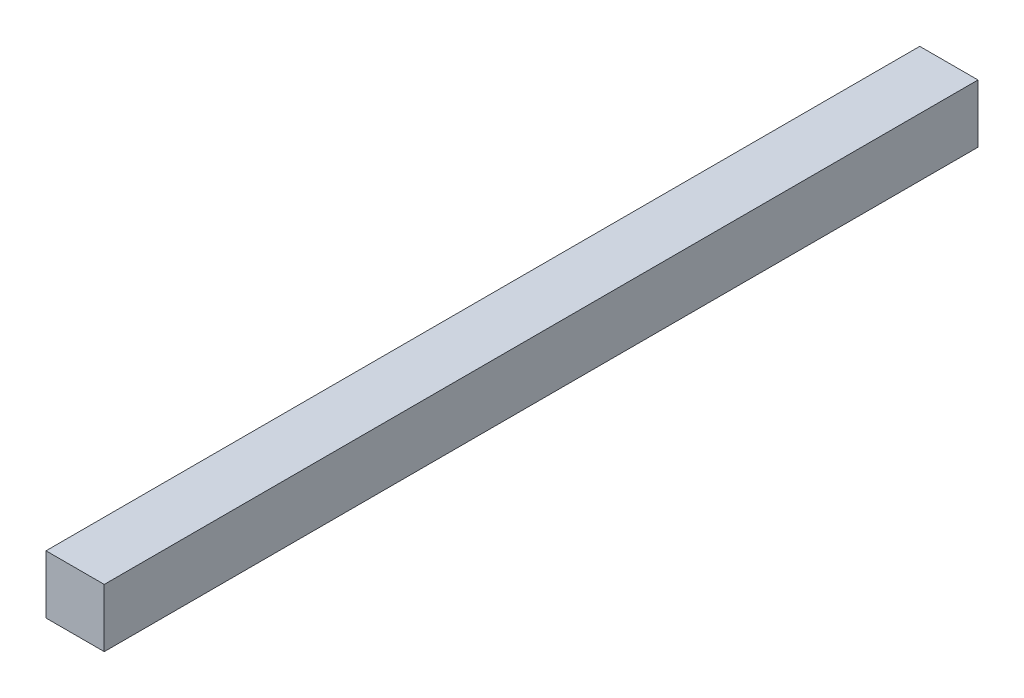
ISO-10303-21;
HEADER;
FILE_DESCRIPTION(('STEP AP214'),'2;1');
FILE_NAME('part.step','',(''),(''),'','','');
FILE_SCHEMA(('AUTOMOTIVE_DESIGN { 1 0 10303 214 1 1 1 1 }'));
ENDSEC;
DATA;
#1=APPLICATION_CONTEXT('core data for automotive mechanical design processes');
#2=APPLICATION_PROTOCOL_DEFINITION('international standard','automotive_design',2000,#1);
#3=PRODUCT_CONTEXT('',#1,'mechanical');
#4=PRODUCT('Part','Part','',(#3));
#5=PRODUCT_RELATED_PRODUCT_CATEGORY('part','',(#4));
#6=PRODUCT_DEFINITION_FORMATION('','',#4);
#7=PRODUCT_DEFINITION_CONTEXT('part definition',#1,'design');
#8=PRODUCT_DEFINITION('design','',#6,#7);
#9=PRODUCT_DEFINITION_SHAPE('','',#8);
#10=(LENGTH_UNIT() NAMED_UNIT(*) SI_UNIT(.MILLI.,.METRE.));
#11=(NAMED_UNIT(*) PLANE_ANGLE_UNIT() SI_UNIT($,.RADIAN.));
#12=(NAMED_UNIT(*) SI_UNIT($,.STERADIAN.) SOLID_ANGLE_UNIT());
#13=UNCERTAINTY_MEASURE_WITH_UNIT(LENGTH_MEASURE(1.E-05),#10,'distance_accuracy_value','');
#14=(GEOMETRIC_REPRESENTATION_CONTEXT(3) GLOBAL_UNCERTAINTY_ASSIGNED_CONTEXT((#13)) GLOBAL_UNIT_ASSIGNED_CONTEXT((#10,
#11,#12)) REPRESENTATION_CONTEXT('',''));
#15=CARTESIAN_POINT('',(0.,0.,0.));
#16=DIRECTION('',(0.,0.,1.));
#17=DIRECTION('',(1.,0.,0.));
#18=AXIS2_PLACEMENT_3D('',#15,#16,#17);
#19=CARTESIAN_POINT('',(0.,0.,150.));
#20=DIRECTION('',(1.,0.,0.));
#21=DIRECTION('',(0.,0.,-1.));
#22=AXIS2_PLACEMENT_3D('',#19,#20,#21);
#23=PLANE('',#22);
#24=DIRECTION('',(0.,-1.,0.));
#25=VECTOR('',#24,1.);
#26=CARTESIAN_POINT('',(0.,0.,0.));
#27=LINE('',#26,#25);
#28=CARTESIAN_POINT('',(0.,10.,0.));
#29=VERTEX_POINT('',#28);
#30=CARTESIAN_POINT('',(0.,0.,0.));
#31=VERTEX_POINT('',#30);
#32=EDGE_CURVE('E96',#29,#31,#27,.T.);
#33=ORIENTED_EDGE('',*,*,#32,.T.);
#34=DIRECTION('',(0.,0.,-1.));
#35=VECTOR('',#34,1.);
#36=CARTESIAN_POINT('',(0.,0.,150.));
#37=LINE('',#36,#35);
#38=CARTESIAN_POINT('',(0.,0.,150.));
#39=VERTEX_POINT('',#38);
#40=EDGE_CURVE('E11',#39,#31,#37,.T.);
#41=ORIENTED_EDGE('',*,*,#40,.F.);
#42=DIRECTION('',(0.,-1.,0.));
#43=VECTOR('',#42,1.);
#44=CARTESIAN_POINT('',(0.,0.,150.));
#45=LINE('',#44,#43);
#46=CARTESIAN_POINT('',(0.,10.,150.));
#47=VERTEX_POINT('',#46);
#48=EDGE_CURVE('E84',#47,#39,#45,.T.);
#49=ORIENTED_EDGE('',*,*,#48,.F.);
#50=DIRECTION('',(0.,0.,-1.));
#51=VECTOR('',#50,1.);
#52=CARTESIAN_POINT('',(0.,10.,150.));
#53=LINE('',#52,#51);
#54=EDGE_CURVE('E92',#47,#29,#53,.T.);
#55=ORIENTED_EDGE('',*,*,#54,.T.);
#56=EDGE_LOOP('',(#33,#41,#49,#55));
#57=FACE_BOUND('',#56,.T.);
#58=ADVANCED_FACE('F33',(#57),#23,.F.);
#59=CARTESIAN_POINT('',(0.,0.,150.));
#60=DIRECTION('',(0.,1.,0.));
#61=DIRECTION('',(0.,0.,1.));
#62=AXIS2_PLACEMENT_3D('',#59,#60,#61);
#63=PLANE('',#62);
#64=DIRECTION('',(1.,0.,0.));
#65=VECTOR('',#64,1.);
#66=CARTESIAN_POINT('',(0.,0.,0.));
#67=LINE('',#66,#65);
#68=CARTESIAN_POINT('',(10.,0.,0.));
#69=VERTEX_POINT('',#68);
#70=EDGE_CURVE('E88',#31,#69,#67,.T.);
#71=ORIENTED_EDGE('',*,*,#70,.T.);
#72=DIRECTION('',(0.,0.,-1.));
#73=VECTOR('',#72,1.);
#74=CARTESIAN_POINT('',(10.,0.,150.));
#75=LINE('',#74,#73);
#76=CARTESIAN_POINT('',(10.,0.,150.));
#77=VERTEX_POINT('',#76);
#78=EDGE_CURVE('E41',#77,#69,#75,.T.);
#79=ORIENTED_EDGE('',*,*,#78,.F.);
#80=DIRECTION('',(1.,0.,0.));
#81=VECTOR('',#80,1.);
#82=CARTESIAN_POINT('',(0.,0.,150.));
#83=LINE('',#82,#81);
#84=EDGE_CURVE('E79',#39,#77,#83,.T.);
#85=ORIENTED_EDGE('',*,*,#84,.F.);
#86=ORIENTED_EDGE('',*,*,#40,.T.);
#87=EDGE_LOOP('',(#71,#79,#85,#86));
#88=FACE_BOUND('',#87,.T.);
#89=ADVANCED_FACE('F87',(#88),#63,.F.);
#90=CARTESIAN_POINT('',(10.,0.,150.));
#91=DIRECTION('',(-1.,0.,0.));
#92=DIRECTION('',(0.,0.,1.));
#93=AXIS2_PLACEMENT_3D('',#90,#91,#92);
#94=PLANE('',#93);
#95=DIRECTION('',(0.,1.,0.));
#96=VECTOR('',#95,1.);
#97=CARTESIAN_POINT('',(10.,0.,0.));
#98=LINE('',#97,#96);
#99=CARTESIAN_POINT('',(10.,10.,0.));
#100=VERTEX_POINT('',#99);
#101=EDGE_CURVE('E66',#69,#100,#98,.T.);
#102=ORIENTED_EDGE('',*,*,#101,.T.);
#103=DIRECTION('',(0.,0.,-1.));
#104=VECTOR('',#103,1.);
#105=CARTESIAN_POINT('',(10.,10.,150.));
#106=LINE('',#105,#104);
#107=CARTESIAN_POINT('',(10.,10.,150.));
#108=VERTEX_POINT('',#107);
#109=EDGE_CURVE('E89',#108,#100,#106,.T.);
#110=ORIENTED_EDGE('',*,*,#109,.F.);
#111=DIRECTION('',(0.,1.,0.));
#112=VECTOR('',#111,1.);
#113=CARTESIAN_POINT('',(10.,0.,150.));
#114=LINE('',#113,#112);
#115=EDGE_CURVE('E82',#77,#108,#114,.T.);
#116=ORIENTED_EDGE('',*,*,#115,.F.);
#117=ORIENTED_EDGE('',*,*,#78,.T.);
#118=EDGE_LOOP('',(#102,#110,#116,#117));
#119=FACE_BOUND('',#118,.T.);
#120=ADVANCED_FACE('F90',(#119),#94,.F.);
#121=CARTESIAN_POINT('',(0.,10.,150.));
#122=DIRECTION('',(0.,-1.,0.));
#123=DIRECTION('',(0.,0.,-1.));
#124=AXIS2_PLACEMENT_3D('',#121,#122,#123);
#125=PLANE('',#124);
#126=DIRECTION('',(-1.,0.,0.));
#127=VECTOR('',#126,1.);
#128=CARTESIAN_POINT('',(0.,10.,0.));
#129=LINE('',#128,#127);
#130=EDGE_CURVE('E72',#100,#29,#129,.T.);
#131=ORIENTED_EDGE('',*,*,#130,.T.);
#132=ORIENTED_EDGE('',*,*,#54,.F.);
#133=DIRECTION('',(-1.,0.,0.));
#134=VECTOR('',#133,1.);
#135=CARTESIAN_POINT('',(0.,10.,150.));
#136=LINE('',#135,#134);
#137=EDGE_CURVE('E49',#108,#47,#136,.T.);
#138=ORIENTED_EDGE('',*,*,#137,.F.);
#139=ORIENTED_EDGE('',*,*,#109,.T.);
#140=EDGE_LOOP('',(#131,#132,#138,#139));
#141=FACE_BOUND('',#140,.T.);
#142=ADVANCED_FACE('F103',(#141),#125,.F.);
#143=CARTESIAN_POINT('',(0.,0.,150.));
#144=DIRECTION('',(0.,0.,-1.));
#145=DIRECTION('',(-1.,0.,0.));
#146=AXIS2_PLACEMENT_3D('',#143,#144,#145);
#147=PLANE('',#146);
#148=ORIENTED_EDGE('',*,*,#48,.T.);
#149=ORIENTED_EDGE('',*,*,#84,.T.);
#150=ORIENTED_EDGE('',*,*,#115,.T.);
#151=ORIENTED_EDGE('',*,*,#137,.T.);
#152=EDGE_LOOP('',(#148,#149,#150,#151));
#153=FACE_BOUND('',#152,.T.);
#154=ADVANCED_FACE('F80',(#153),#147,.F.);
#155=CARTESIAN_POINT('',(0.,0.,0.));
#156=DIRECTION('',(0.,0.,-1.));
#157=DIRECTION('',(-1.,0.,0.));
#158=AXIS2_PLACEMENT_3D('',#155,#156,#157);
#159=PLANE('',#158);
#160=ORIENTED_EDGE('',*,*,#32,.F.);
#161=ORIENTED_EDGE('',*,*,#130,.F.);
#162=ORIENTED_EDGE('',*,*,#101,.F.);
#163=ORIENTED_EDGE('',*,*,#70,.F.);
#164=EDGE_LOOP('',(#160,#161,#162,#163));
#165=FACE_BOUND('',#164,.T.);
#166=ADVANCED_FACE('F106',(#165),#159,.T.);
#167=CLOSED_SHELL('',(#58,#89,#120,#142,#154,#166));
#168=MANIFOLD_SOLID_BREP('B2',#167);
#169=ADVANCED_BREP_SHAPE_REPRESENTATION('',(#18,#168),#14);
#170=SHAPE_DEFINITION_REPRESENTATION(#9,#169);
ENDSEC;
END-ISO-10303-21;
